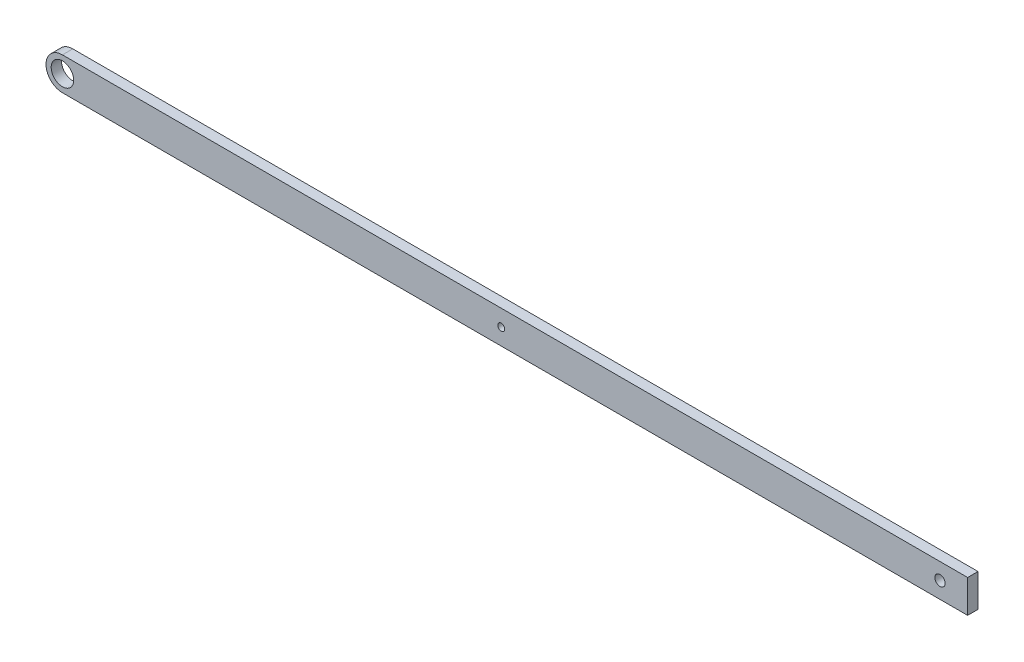
ISO-10303-21;
HEADER;
FILE_DESCRIPTION(('STEP AP214'),'2;1');
FILE_NAME('part.step','',(''),(''),'','','');
FILE_SCHEMA(('AUTOMOTIVE_DESIGN { 1 0 10303 214 1 1 1 1 }'));
ENDSEC;
DATA;
#1=APPLICATION_CONTEXT('core data for automotive mechanical design processes');
#2=APPLICATION_PROTOCOL_DEFINITION('international standard','automotive_design',2000,#1);
#3=PRODUCT_CONTEXT('',#1,'mechanical');
#4=PRODUCT('Part','Part','',(#3));
#5=PRODUCT_RELATED_PRODUCT_CATEGORY('part','',(#4));
#6=PRODUCT_DEFINITION_FORMATION('','',#4);
#7=PRODUCT_DEFINITION_CONTEXT('part definition',#1,'design');
#8=PRODUCT_DEFINITION('design','',#6,#7);
#9=PRODUCT_DEFINITION_SHAPE('','',#8);
#10=(LENGTH_UNIT() NAMED_UNIT(*) SI_UNIT(.MILLI.,.METRE.));
#11=(NAMED_UNIT(*) PLANE_ANGLE_UNIT() SI_UNIT($,.RADIAN.));
#12=(NAMED_UNIT(*) SI_UNIT($,.STERADIAN.) SOLID_ANGLE_UNIT());
#13=UNCERTAINTY_MEASURE_WITH_UNIT(LENGTH_MEASURE(1.E-05),#10,'distance_accuracy_value','');
#14=(GEOMETRIC_REPRESENTATION_CONTEXT(3) GLOBAL_UNCERTAINTY_ASSIGNED_CONTEXT((#13)) GLOBAL_UNIT_ASSIGNED_CONTEXT((#10,
#11,#12)) REPRESENTATION_CONTEXT('',''));
#15=CARTESIAN_POINT('',(0.,0.,0.));
#16=DIRECTION('',(0.,0.,1.));
#17=DIRECTION('',(1.,0.,0.));
#18=AXIS2_PLACEMENT_3D('',#15,#16,#17);
#19=CARTESIAN_POINT('',(0.,0.,1.5));
#20=DIRECTION('',(0.,0.,-1.));
#21=DIRECTION('',(-1.,0.,0.));
#22=AXIS2_PLACEMENT_3D('',#19,#20,#21);
#23=CYLINDRICAL_SURFACE('',#22,4.75);
#24=CARTESIAN_POINT('',(0.,0.,-1.5));
#25=DIRECTION('',(0.,0.,1.));
#26=DIRECTION('',(1.,0.,0.));
#27=AXIS2_PLACEMENT_3D('',#24,#25,#26);
#28=CIRCLE('',#27,4.75);
#29=CARTESIAN_POINT('',(0.,4.75,-1.5));
#30=VERTEX_POINT('',#29);
#31=CARTESIAN_POINT('',(0.,-4.75,-1.5));
#32=VERTEX_POINT('',#31);
#33=EDGE_CURVE('E110',#30,#32,#28,.T.);
#34=ORIENTED_EDGE('',*,*,#33,.T.);
#35=DIRECTION('',(0.,0.,-1.));
#36=VECTOR('',#35,1.);
#37=CARTESIAN_POINT('',(0.,-4.75,1.5));
#38=LINE('',#37,#36);
#39=CARTESIAN_POINT('',(0.,-4.75,1.5));
#40=VERTEX_POINT('',#39);
#41=EDGE_CURVE('E11',#40,#32,#38,.T.);
#42=ORIENTED_EDGE('',*,*,#41,.F.);
#43=CARTESIAN_POINT('',(0.,0.,1.5));
#44=DIRECTION('',(0.,0.,1.));
#45=DIRECTION('',(1.,0.,0.));
#46=AXIS2_PLACEMENT_3D('',#43,#44,#45);
#47=CIRCLE('',#46,4.75);
#48=CARTESIAN_POINT('',(0.,4.75,1.5));
#49=VERTEX_POINT('',#48);
#50=EDGE_CURVE('E94',#49,#40,#47,.T.);
#51=ORIENTED_EDGE('',*,*,#50,.F.);
#52=DIRECTION('',(0.,0.,-1.));
#53=VECTOR('',#52,1.);
#54=CARTESIAN_POINT('',(0.,4.75,1.5));
#55=LINE('',#54,#53);
#56=EDGE_CURVE('E103',#49,#30,#55,.T.);
#57=ORIENTED_EDGE('',*,*,#56,.T.);
#58=EDGE_LOOP('',(#34,#42,#51,#57));
#59=FACE_BOUND('',#58,.T.);
#60=ADVANCED_FACE('F41',(#59),#23,.T.);
#61=CARTESIAN_POINT('',(0.,-4.75,1.5));
#62=DIRECTION('',(0.,1.,0.));
#63=DIRECTION('',(0.,0.,1.));
#64=AXIS2_PLACEMENT_3D('',#61,#62,#63);
#65=PLANE('',#64);
#66=DIRECTION('',(1.,0.,0.));
#67=VECTOR('',#66,1.);
#68=CARTESIAN_POINT('',(0.,-4.75,-1.5));
#69=LINE('',#68,#67);
#70=CARTESIAN_POINT('',(262.,-4.75,-1.5));
#71=VERTEX_POINT('',#70);
#72=EDGE_CURVE('E98',#32,#71,#69,.T.);
#73=ORIENTED_EDGE('',*,*,#72,.T.);
#74=DIRECTION('',(0.,0.,-1.));
#75=VECTOR('',#74,1.);
#76=CARTESIAN_POINT('',(262.,-4.75,1.5));
#77=LINE('',#76,#75);
#78=CARTESIAN_POINT('',(262.,-4.75,1.5));
#79=VERTEX_POINT('',#78);
#80=EDGE_CURVE('E49',#79,#71,#77,.T.);
#81=ORIENTED_EDGE('',*,*,#80,.F.);
#82=DIRECTION('',(1.,0.,0.));
#83=VECTOR('',#82,1.);
#84=CARTESIAN_POINT('',(0.,-4.75,1.5));
#85=LINE('',#84,#83);
#86=EDGE_CURVE('E90',#40,#79,#85,.T.);
#87=ORIENTED_EDGE('',*,*,#86,.F.);
#88=ORIENTED_EDGE('',*,*,#41,.T.);
#89=EDGE_LOOP('',(#73,#81,#87,#88));
#90=FACE_BOUND('',#89,.T.);
#91=ADVANCED_FACE('F100',(#90),#65,.F.);
#92=CARTESIAN_POINT('',(262.,-4.75,1.5));
#93=DIRECTION('',(-1.,0.,0.));
#94=DIRECTION('',(0.,0.,1.));
#95=AXIS2_PLACEMENT_3D('',#92,#93,#94);
#96=PLANE('',#95);
#97=DIRECTION('',(0.,1.,0.));
#98=VECTOR('',#97,1.);
#99=CARTESIAN_POINT('',(262.,-4.75,-1.5));
#100=LINE('',#99,#98);
#101=CARTESIAN_POINT('',(262.,4.75,-1.5));
#102=VERTEX_POINT('',#101);
#103=EDGE_CURVE('E79',#71,#102,#100,.T.);
#104=ORIENTED_EDGE('',*,*,#103,.T.);
#105=DIRECTION('',(0.,0.,-1.));
#106=VECTOR('',#105,1.);
#107=CARTESIAN_POINT('',(262.,4.75,1.5));
#108=LINE('',#107,#106);
#109=CARTESIAN_POINT('',(262.,4.75,1.5));
#110=VERTEX_POINT('',#109);
#111=EDGE_CURVE('E97',#110,#102,#108,.T.);
#112=ORIENTED_EDGE('',*,*,#111,.F.);
#113=DIRECTION('',(0.,1.,0.));
#114=VECTOR('',#113,1.);
#115=CARTESIAN_POINT('',(262.,-4.75,1.5));
#116=LINE('',#115,#114);
#117=EDGE_CURVE('E95',#79,#110,#116,.T.);
#118=ORIENTED_EDGE('',*,*,#117,.F.);
#119=ORIENTED_EDGE('',*,*,#80,.T.);
#120=EDGE_LOOP('',(#104,#112,#118,#119));
#121=FACE_BOUND('',#120,.T.);
#122=ADVANCED_FACE('F101',(#121),#96,.F.);
#123=CARTESIAN_POINT('',(262.,4.75,1.5));
#124=DIRECTION('',(0.,-1.,0.));
#125=DIRECTION('',(0.,0.,-1.));
#126=AXIS2_PLACEMENT_3D('',#123,#124,#125);
#127=PLANE('',#126);
#128=DIRECTION('',(-1.,0.,0.));
#129=VECTOR('',#128,1.);
#130=CARTESIAN_POINT('',(262.,4.75,-1.5));
#131=LINE('',#130,#129);
#132=EDGE_CURVE('E85',#102,#30,#131,.T.);
#133=ORIENTED_EDGE('',*,*,#132,.T.);
#134=ORIENTED_EDGE('',*,*,#56,.F.);
#135=DIRECTION('',(-1.,0.,0.));
#136=VECTOR('',#135,1.);
#137=CARTESIAN_POINT('',(262.,4.75,1.5));
#138=LINE('',#137,#136);
#139=EDGE_CURVE('E56',#110,#49,#138,.T.);
#140=ORIENTED_EDGE('',*,*,#139,.F.);
#141=ORIENTED_EDGE('',*,*,#111,.T.);
#142=EDGE_LOOP('',(#133,#134,#140,#141));
#143=FACE_BOUND('',#142,.T.);
#144=ADVANCED_FACE('F162',(#143),#127,.F.);
#145=CARTESIAN_POINT('',(0.,0.,1.5));
#146=DIRECTION('',(0.,0.,1.));
#147=DIRECTION('',(1.,0.,0.));
#148=AXIS2_PLACEMENT_3D('',#145,#146,#147);
#149=PLANE('',#148);
#150=CARTESIAN_POINT('',(0.,0.,1.5));
#151=DIRECTION('',(0.,0.,1.));
#152=DIRECTION('',(1.,0.,0.));
#153=AXIS2_PLACEMENT_3D('',#150,#151,#152);
#154=CIRCLE('',#153,3.25);
#155=CARTESIAN_POINT('',(3.25,0.,1.5));
#156=VERTEX_POINT('',#155);
#157=EDGE_CURVE('E109',#156,#156,#154,.T.);
#158=ORIENTED_EDGE('',*,*,#157,.F.);
#159=EDGE_LOOP('',(#158));
#160=FACE_BOUND('',#159,.T.);
#161=CARTESIAN_POINT('',(127.,0.,1.5));
#162=DIRECTION('',(0.,0.,1.));
#163=DIRECTION('',(1.,0.,0.));
#164=AXIS2_PLACEMENT_3D('',#161,#162,#163);
#165=CIRCLE('',#164,0.999999999999998);
#166=CARTESIAN_POINT('',(128.,0.,1.5));
#167=VERTEX_POINT('',#166);
#168=EDGE_CURVE('E121',#167,#167,#165,.T.);
#169=ORIENTED_EDGE('',*,*,#168,.F.);
#170=EDGE_LOOP('',(#169));
#171=FACE_BOUND('',#170,.T.);
#172=CARTESIAN_POINT('',(254.,0.,1.5));
#173=DIRECTION('',(0.,0.,1.));
#174=DIRECTION('',(1.,0.,0.));
#175=AXIS2_PLACEMENT_3D('',#172,#173,#174);
#176=CIRCLE('',#175,1.50000000000002);
#177=CARTESIAN_POINT('',(255.5,0.,1.5));
#178=VERTEX_POINT('',#177);
#179=EDGE_CURVE('E120',#178,#178,#176,.T.);
#180=ORIENTED_EDGE('',*,*,#179,.F.);
#181=EDGE_LOOP('',(#180));
#182=FACE_BOUND('',#181,.T.);
#183=ORIENTED_EDGE('',*,*,#50,.T.);
#184=ORIENTED_EDGE('',*,*,#86,.T.);
#185=ORIENTED_EDGE('',*,*,#117,.T.);
#186=ORIENTED_EDGE('',*,*,#139,.T.);
#187=EDGE_LOOP('',(#183,#184,#185,#186));
#188=FACE_BOUND('',#187,.T.);
#189=ADVANCED_FACE('F89',(#160,#171,#182,#188),#149,.T.);
#190=CARTESIAN_POINT('',(0.,0.,-1.5));
#191=DIRECTION('',(0.,0.,1.));
#192=DIRECTION('',(1.,0.,0.));
#193=AXIS2_PLACEMENT_3D('',#190,#191,#192);
#194=PLANE('',#193);
#195=CARTESIAN_POINT('',(0.,0.,-1.5));
#196=DIRECTION('',(0.,0.,1.));
#197=DIRECTION('',(1.,0.,0.));
#198=AXIS2_PLACEMENT_3D('',#195,#196,#197);
#199=CIRCLE('',#198,3.25);
#200=CARTESIAN_POINT('',(3.25,0.,-1.5));
#201=VERTEX_POINT('',#200);
#202=EDGE_CURVE('E42',#201,#201,#199,.T.);
#203=ORIENTED_EDGE('',*,*,#202,.T.);
#204=EDGE_LOOP('',(#203));
#205=FACE_BOUND('',#204,.T.);
#206=CARTESIAN_POINT('',(127.,0.,-1.5));
#207=DIRECTION('',(0.,0.,1.));
#208=DIRECTION('',(1.,0.,0.));
#209=AXIS2_PLACEMENT_3D('',#206,#207,#208);
#210=CIRCLE('',#209,0.999999999999998);
#211=CARTESIAN_POINT('',(128.,0.,-1.5));
#212=VERTEX_POINT('',#211);
#213=EDGE_CURVE('E118',#212,#212,#210,.T.);
#214=ORIENTED_EDGE('',*,*,#213,.T.);
#215=EDGE_LOOP('',(#214));
#216=FACE_BOUND('',#215,.T.);
#217=CARTESIAN_POINT('',(254.,0.,-1.5));
#218=DIRECTION('',(0.,0.,1.));
#219=DIRECTION('',(1.,0.,0.));
#220=AXIS2_PLACEMENT_3D('',#217,#218,#219);
#221=CIRCLE('',#220,1.50000000000002);
#222=CARTESIAN_POINT('',(255.5,0.,-1.5));
#223=VERTEX_POINT('',#222);
#224=EDGE_CURVE('E119',#223,#223,#221,.T.);
#225=ORIENTED_EDGE('',*,*,#224,.T.);
#226=EDGE_LOOP('',(#225));
#227=FACE_BOUND('',#226,.T.);
#228=ORIENTED_EDGE('',*,*,#33,.F.);
#229=ORIENTED_EDGE('',*,*,#132,.F.);
#230=ORIENTED_EDGE('',*,*,#103,.F.);
#231=ORIENTED_EDGE('',*,*,#72,.F.);
#232=EDGE_LOOP('',(#228,#229,#230,#231));
#233=FACE_BOUND('',#232,.T.);
#234=ADVANCED_FACE('F140',(#205,#216,#227,#233),#194,.F.);
#235=CARTESIAN_POINT('',(254.,0.,-20.));
#236=DIRECTION('',(0.,0.,1.));
#237=DIRECTION('',(1.,0.,0.));
#238=AXIS2_PLACEMENT_3D('',#235,#236,#237);
#239=CYLINDRICAL_SURFACE('',#238,1.50000000000002);
#240=ORIENTED_EDGE('',*,*,#179,.T.);
#241=EDGE_LOOP('',(#240));
#242=FACE_BOUND('',#241,.T.);
#243=ORIENTED_EDGE('',*,*,#224,.F.);
#244=EDGE_LOOP('',(#243));
#245=FACE_BOUND('',#244,.T.);
#246=ADVANCED_FACE('F148',(#242,#245),#239,.F.);
#247=CARTESIAN_POINT('',(127.,0.,-20.));
#248=DIRECTION('',(0.,0.,1.));
#249=DIRECTION('',(1.,0.,0.));
#250=AXIS2_PLACEMENT_3D('',#247,#248,#249);
#251=CYLINDRICAL_SURFACE('',#250,0.999999999999998);
#252=ORIENTED_EDGE('',*,*,#168,.T.);
#253=EDGE_LOOP('',(#252));
#254=FACE_BOUND('',#253,.T.);
#255=ORIENTED_EDGE('',*,*,#213,.F.);
#256=EDGE_LOOP('',(#255));
#257=FACE_BOUND('',#256,.T.);
#258=ADVANCED_FACE('F143',(#254,#257),#251,.F.);
#259=CARTESIAN_POINT('',(0.,0.,-20.));
#260=DIRECTION('',(0.,0.,1.));
#261=DIRECTION('',(1.,0.,0.));
#262=AXIS2_PLACEMENT_3D('',#259,#260,#261);
#263=CYLINDRICAL_SURFACE('',#262,3.25);
#264=ORIENTED_EDGE('',*,*,#157,.T.);
#265=EDGE_LOOP('',(#264));
#266=FACE_BOUND('',#265,.T.);
#267=ORIENTED_EDGE('',*,*,#202,.F.);
#268=EDGE_LOOP('',(#267));
#269=FACE_BOUND('',#268,.T.);
#270=ADVANCED_FACE('F138',(#266,#269),#263,.F.);
#271=CLOSED_SHELL('',(#60,#91,#122,#144,#189,#234,#246,#258,#270));
#272=MANIFOLD_SOLID_BREP('B2',#271);
#273=ADVANCED_BREP_SHAPE_REPRESENTATION('',(#18,#272),#14);
#274=SHAPE_DEFINITION_REPRESENTATION(#9,#273);
ENDSEC;
END-ISO-10303-21;
